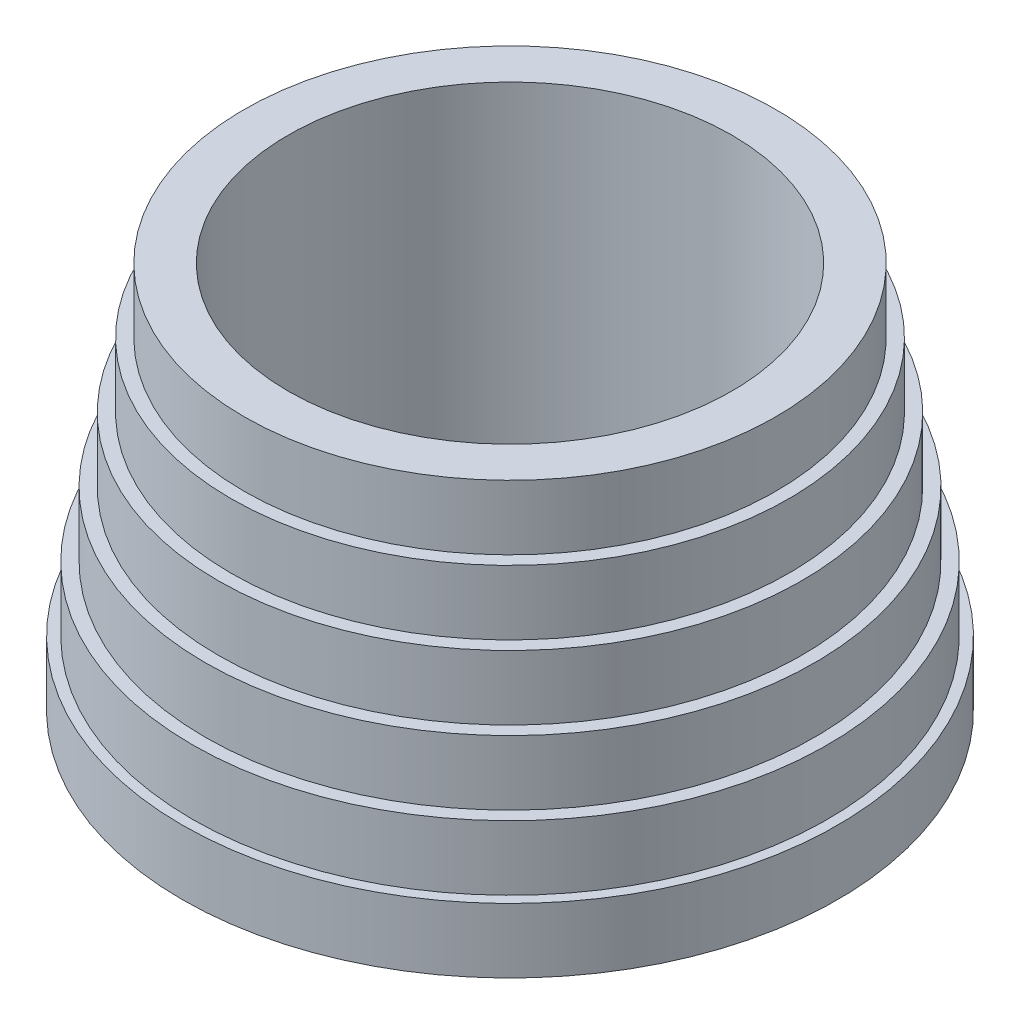
ISO-10303-21;
HEADER;
FILE_DESCRIPTION(('STEP AP214'),'2;1');
FILE_NAME('part.step','',(''),(''),'','','');
FILE_SCHEMA(('AUTOMOTIVE_DESIGN { 1 0 10303 214 1 1 1 1 }'));
ENDSEC;
DATA;
#1=APPLICATION_CONTEXT('core data for automotive mechanical design processes');
#2=APPLICATION_PROTOCOL_DEFINITION('international standard','automotive_design',2000,#1);
#3=PRODUCT_CONTEXT('',#1,'mechanical');
#4=PRODUCT('Part','Part','',(#3));
#5=PRODUCT_RELATED_PRODUCT_CATEGORY('part','',(#4));
#6=PRODUCT_DEFINITION_FORMATION('','',#4);
#7=PRODUCT_DEFINITION_CONTEXT('part definition',#1,'design');
#8=PRODUCT_DEFINITION('design','',#6,#7);
#9=PRODUCT_DEFINITION_SHAPE('','',#8);
#10=(LENGTH_UNIT() NAMED_UNIT(*) SI_UNIT(.MILLI.,.METRE.));
#11=(NAMED_UNIT(*) PLANE_ANGLE_UNIT() SI_UNIT($,.RADIAN.));
#12=(NAMED_UNIT(*) SI_UNIT($,.STERADIAN.) SOLID_ANGLE_UNIT());
#13=UNCERTAINTY_MEASURE_WITH_UNIT(LENGTH_MEASURE(1.E-05),#10,'distance_accuracy_value','');
#14=(GEOMETRIC_REPRESENTATION_CONTEXT(3) GLOBAL_UNCERTAINTY_ASSIGNED_CONTEXT((#13)) GLOBAL_UNIT_ASSIGNED_CONTEXT((#10,
#11,#12)) REPRESENTATION_CONTEXT('',''));
#15=CARTESIAN_POINT('',(0.,0.,0.));
#16=DIRECTION('',(0.,0.,1.));
#17=DIRECTION('',(1.,0.,0.));
#18=AXIS2_PLACEMENT_3D('',#15,#16,#17);
#19=CARTESIAN_POINT('',(0.,105.494376543482,0.));
#20=DIRECTION('',(0.,1.,0.));
#21=DIRECTION('',(0.,0.,1.));
#22=AXIS2_PLACEMENT_3D('',#19,#20,#21);
#23=CYLINDRICAL_SURFACE('',#22,225.994242039782);
#24=CARTESIAN_POINT('',(0.,-40.,0.));
#25=DIRECTION('',(0.,1.,0.));
#26=DIRECTION('',(0.,0.,1.));
#27=AXIS2_PLACEMENT_3D('',#24,#25,#26);
#28=CIRCLE('',#27,225.994242039782);
#29=CARTESIAN_POINT('',(0.,-40.,225.994242039782));
#30=VERTEX_POINT('',#29);
#31=EDGE_CURVE('E119',#30,#30,#28,.T.);
#32=ORIENTED_EDGE('',*,*,#31,.T.);
#33=EDGE_LOOP('',(#32));
#34=FACE_BOUND('',#33,.T.);
#35=CARTESIAN_POINT('',(0.,9.99999999999999,0.));
#36=DIRECTION('',(0.,1.,0.));
#37=DIRECTION('',(0.,0.,1.));
#38=AXIS2_PLACEMENT_3D('',#35,#36,#37);
#39=CIRCLE('',#38,225.994242039782);
#40=CARTESIAN_POINT('',(0.,9.99999999999999,225.994242039782));
#41=VERTEX_POINT('',#40);
#42=EDGE_CURVE('E53',#41,#41,#39,.T.);
#43=ORIENTED_EDGE('',*,*,#42,.F.);
#44=EDGE_LOOP('',(#43));
#45=FACE_BOUND('',#44,.T.);
#46=ADVANCED_FACE('F41',(#34,#45),#23,.T.);
#47=CARTESIAN_POINT('',(-225.994242039782,9.99999999999999,0.));
#48=DIRECTION('',(0.,1.,0.));
#49=DIRECTION('',(0.,0.,1.));
#50=AXIS2_PLACEMENT_3D('',#47,#48,#49);
#51=PLANE('',#50);
#52=ORIENTED_EDGE('',*,*,#42,.T.);
#53=EDGE_LOOP('',(#52));
#54=FACE_BOUND('',#53,.T.);
#55=CARTESIAN_POINT('',(0.,9.99999999999999,0.));
#56=DIRECTION('',(0.,1.,0.));
#57=DIRECTION('',(0.,0.,1.));
#58=AXIS2_PLACEMENT_3D('',#55,#56,#57);
#59=CIRCLE('',#58,215.994242039782);
#60=CARTESIAN_POINT('',(0.,9.99999999999999,215.994242039782));
#61=VERTEX_POINT('',#60);
#62=EDGE_CURVE('E57',#61,#61,#59,.T.);
#63=ORIENTED_EDGE('',*,*,#62,.F.);
#64=EDGE_LOOP('',(#63));
#65=FACE_BOUND('',#64,.T.);
#66=ADVANCED_FACE('F157',(#54,#65),#51,.T.);
#67=CARTESIAN_POINT('',(0.,105.494376543482,0.));
#68=DIRECTION('',(0.,1.,0.));
#69=DIRECTION('',(0.,0.,1.));
#70=AXIS2_PLACEMENT_3D('',#67,#68,#69);
#71=CYLINDRICAL_SURFACE('',#70,215.994242039782);
#72=ORIENTED_EDGE('',*,*,#62,.T.);
#73=EDGE_LOOP('',(#72));
#74=FACE_BOUND('',#73,.T.);
#75=CARTESIAN_POINT('',(0.,60.,0.));
#76=DIRECTION('',(0.,1.,0.));
#77=DIRECTION('',(0.,0.,1.));
#78=AXIS2_PLACEMENT_3D('',#75,#76,#77);
#79=CIRCLE('',#78,215.994242039782);
#80=CARTESIAN_POINT('',(0.,60.,215.994242039782));
#81=VERTEX_POINT('',#80);
#82=EDGE_CURVE('E62',#81,#81,#79,.T.);
#83=ORIENTED_EDGE('',*,*,#82,.F.);
#84=EDGE_LOOP('',(#83));
#85=FACE_BOUND('',#84,.T.);
#86=ADVANCED_FACE('F162',(#74,#85),#71,.T.);
#87=CARTESIAN_POINT('',(-215.994242039782,60.,0.));
#88=DIRECTION('',(0.,1.,0.));
#89=DIRECTION('',(0.,0.,1.));
#90=AXIS2_PLACEMENT_3D('',#87,#88,#89);
#91=PLANE('',#90);
#92=ORIENTED_EDGE('',*,*,#82,.T.);
#93=EDGE_LOOP('',(#92));
#94=FACE_BOUND('',#93,.T.);
#95=CARTESIAN_POINT('',(0.,60.,0.));
#96=DIRECTION('',(0.,1.,0.));
#97=DIRECTION('',(0.,0.,1.));
#98=AXIS2_PLACEMENT_3D('',#95,#96,#97);
#99=CIRCLE('',#98,205.994242039782);
#100=CARTESIAN_POINT('',(0.,60.,205.994242039782));
#101=VERTEX_POINT('',#100);
#102=EDGE_CURVE('E65',#101,#101,#99,.T.);
#103=ORIENTED_EDGE('',*,*,#102,.F.);
#104=EDGE_LOOP('',(#103));
#105=FACE_BOUND('',#104,.T.);
#106=ADVANCED_FACE('F153',(#94,#105),#91,.T.);
#107=CARTESIAN_POINT('',(0.,105.494376543482,0.));
#108=DIRECTION('',(0.,1.,0.));
#109=DIRECTION('',(0.,0.,1.));
#110=AXIS2_PLACEMENT_3D('',#107,#108,#109);
#111=CYLINDRICAL_SURFACE('',#110,205.994242039782);
#112=ORIENTED_EDGE('',*,*,#102,.T.);
#113=EDGE_LOOP('',(#112));
#114=FACE_BOUND('',#113,.T.);
#115=CARTESIAN_POINT('',(0.,110.,0.));
#116=DIRECTION('',(0.,1.,0.));
#117=DIRECTION('',(0.,0.,1.));
#118=AXIS2_PLACEMENT_3D('',#115,#116,#117);
#119=CIRCLE('',#118,205.994242039782);
#120=CARTESIAN_POINT('',(0.,110.,205.994242039782));
#121=VERTEX_POINT('',#120);
#122=EDGE_CURVE('E68',#121,#121,#119,.T.);
#123=ORIENTED_EDGE('',*,*,#122,.F.);
#124=EDGE_LOOP('',(#123));
#125=FACE_BOUND('',#124,.T.);
#126=ADVANCED_FACE('F143',(#114,#125),#111,.T.);
#127=CARTESIAN_POINT('',(-205.994242039782,110.,0.));
#128=DIRECTION('',(0.,1.,0.));
#129=DIRECTION('',(0.,0.,1.));
#130=AXIS2_PLACEMENT_3D('',#127,#128,#129);
#131=PLANE('',#130);
#132=ORIENTED_EDGE('',*,*,#122,.T.);
#133=EDGE_LOOP('',(#132));
#134=FACE_BOUND('',#133,.T.);
#135=CARTESIAN_POINT('',(0.,110.,0.));
#136=DIRECTION('',(0.,1.,0.));
#137=DIRECTION('',(0.,0.,1.));
#138=AXIS2_PLACEMENT_3D('',#135,#136,#137);
#139=CIRCLE('',#138,171.779053358079);
#140=CARTESIAN_POINT('',(0.,110.,171.779053358079));
#141=VERTEX_POINT('',#140);
#142=EDGE_CURVE('E126',#141,#141,#139,.T.);
#143=ORIENTED_EDGE('',*,*,#142,.F.);
#144=EDGE_LOOP('',(#143));
#145=FACE_BOUND('',#144,.T.);
#146=ADVANCED_FACE('F140',(#134,#145),#131,.T.);
#147=CARTESIAN_POINT('',(-205.994242039782,50.,0.));
#148=DIRECTION('',(0.,-1.,0.));
#149=DIRECTION('',(0.,0.,-1.));
#150=AXIS2_PLACEMENT_3D('',#147,#148,#149);
#151=PLANE('',#150);
#152=CARTESIAN_POINT('',(0.,50.,0.));
#153=DIRECTION('',(0.,-1.,0.));
#154=DIRECTION('',(0.,0.,-1.));
#155=AXIS2_PLACEMENT_3D('',#152,#153,#154);
#156=CIRCLE('',#155,195.994242039782);
#157=CARTESIAN_POINT('',(0.,50.,-195.994242039782));
#158=VERTEX_POINT('',#157);
#159=EDGE_CURVE('E122',#158,#158,#156,.T.);
#160=ORIENTED_EDGE('',*,*,#159,.F.);
#161=EDGE_LOOP('',(#160));
#162=FACE_BOUND('',#161,.T.);
#163=CARTESIAN_POINT('',(0.,50.,0.));
#164=DIRECTION('',(0.,1.,0.));
#165=DIRECTION('',(0.,0.,1.));
#166=AXIS2_PLACEMENT_3D('',#163,#164,#165);
#167=CIRCLE('',#166,205.994242039782);
#168=CARTESIAN_POINT('',(0.,50.,205.994242039782));
#169=VERTEX_POINT('',#168);
#170=EDGE_CURVE('E71',#169,#169,#167,.T.);
#171=ORIENTED_EDGE('',*,*,#170,.F.);
#172=EDGE_LOOP('',(#171));
#173=FACE_BOUND('',#172,.T.);
#174=ADVANCED_FACE('F142',(#162,#173),#151,.T.);
#175=CARTESIAN_POINT('',(0.,105.494376543482,0.));
#176=DIRECTION('',(0.,1.,0.));
#177=DIRECTION('',(0.,0.,1.));
#178=AXIS2_PLACEMENT_3D('',#175,#176,#177);
#179=CYLINDRICAL_SURFACE('',#178,205.994242039782);
#180=ORIENTED_EDGE('',*,*,#170,.T.);
#181=EDGE_LOOP('',(#180));
#182=FACE_BOUND('',#181,.T.);
#183=CARTESIAN_POINT('',(0.,0.,0.));
#184=DIRECTION('',(0.,1.,0.));
#185=DIRECTION('',(0.,0.,1.));
#186=AXIS2_PLACEMENT_3D('',#183,#184,#185);
#187=CIRCLE('',#186,205.994242039782);
#188=CARTESIAN_POINT('',(0.,0.,205.994242039782));
#189=VERTEX_POINT('',#188);
#190=EDGE_CURVE('E74',#189,#189,#187,.T.);
#191=ORIENTED_EDGE('',*,*,#190,.F.);
#192=EDGE_LOOP('',(#191));
#193=FACE_BOUND('',#192,.T.);
#194=ADVANCED_FACE('F150',(#182,#193),#179,.F.);
#195=CARTESIAN_POINT('',(-215.994242039782,0.,0.));
#196=DIRECTION('',(0.,-1.,0.));
#197=DIRECTION('',(0.,0.,-1.));
#198=AXIS2_PLACEMENT_3D('',#195,#196,#197);
#199=PLANE('',#198);
#200=ORIENTED_EDGE('',*,*,#190,.T.);
#201=EDGE_LOOP('',(#200));
#202=FACE_BOUND('',#201,.T.);
#203=CARTESIAN_POINT('',(0.,0.,0.));
#204=DIRECTION('',(0.,1.,0.));
#205=DIRECTION('',(0.,0.,1.));
#206=AXIS2_PLACEMENT_3D('',#203,#204,#205);
#207=CIRCLE('',#206,215.994242039782);
#208=CARTESIAN_POINT('',(0.,0.,215.994242039782));
#209=VERTEX_POINT('',#208);
#210=EDGE_CURVE('E77',#209,#209,#207,.T.);
#211=ORIENTED_EDGE('',*,*,#210,.F.);
#212=EDGE_LOOP('',(#211));
#213=FACE_BOUND('',#212,.T.);
#214=ADVANCED_FACE('F204',(#202,#213),#199,.T.);
#215=CARTESIAN_POINT('',(0.,105.494376543482,0.));
#216=DIRECTION('',(0.,1.,0.));
#217=DIRECTION('',(0.,0.,1.));
#218=AXIS2_PLACEMENT_3D('',#215,#216,#217);
#219=CYLINDRICAL_SURFACE('',#218,215.994242039782);
#220=ORIENTED_EDGE('',*,*,#210,.T.);
#221=EDGE_LOOP('',(#220));
#222=FACE_BOUND('',#221,.T.);
#223=CARTESIAN_POINT('',(0.,-50.,0.));
#224=DIRECTION('',(0.,1.,0.));
#225=DIRECTION('',(0.,0.,1.));
#226=AXIS2_PLACEMENT_3D('',#223,#224,#225);
#227=CIRCLE('',#226,215.994242039782);
#228=CARTESIAN_POINT('',(0.,-50.,215.994242039782));
#229=VERTEX_POINT('',#228);
#230=EDGE_CURVE('E80',#229,#229,#227,.T.);
#231=ORIENTED_EDGE('',*,*,#230,.F.);
#232=EDGE_LOOP('',(#231));
#233=FACE_BOUND('',#232,.T.);
#234=ADVANCED_FACE('F215',(#222,#233),#219,.F.);
#235=CARTESIAN_POINT('',(-225.994242039782,-50.,0.));
#236=DIRECTION('',(0.,-1.,0.));
#237=DIRECTION('',(0.,0.,-1.));
#238=AXIS2_PLACEMENT_3D('',#235,#236,#237);
#239=PLANE('',#238);
#240=ORIENTED_EDGE('',*,*,#230,.T.);
#241=EDGE_LOOP('',(#240));
#242=FACE_BOUND('',#241,.T.);
#243=CARTESIAN_POINT('',(0.,-50.,0.));
#244=DIRECTION('',(0.,1.,0.));
#245=DIRECTION('',(0.,0.,1.));
#246=AXIS2_PLACEMENT_3D('',#243,#244,#245);
#247=CIRCLE('',#246,225.994242039782);
#248=CARTESIAN_POINT('',(0.,-50.,225.994242039782));
#249=VERTEX_POINT('',#248);
#250=EDGE_CURVE('E83',#249,#249,#247,.T.);
#251=ORIENTED_EDGE('',*,*,#250,.F.);
#252=EDGE_LOOP('',(#251));
#253=FACE_BOUND('',#252,.T.);
#254=ADVANCED_FACE('F226',(#242,#253),#239,.T.);
#255=CARTESIAN_POINT('',(0.,105.494376543482,0.));
#256=DIRECTION('',(0.,1.,0.));
#257=DIRECTION('',(0.,0.,1.));
#258=AXIS2_PLACEMENT_3D('',#255,#256,#257);
#259=CYLINDRICAL_SURFACE('',#258,225.994242039782);
#260=ORIENTED_EDGE('',*,*,#250,.T.);
#261=EDGE_LOOP('',(#260));
#262=FACE_BOUND('',#261,.T.);
#263=CARTESIAN_POINT('',(0.,-100.,0.));
#264=DIRECTION('',(0.,1.,0.));
#265=DIRECTION('',(0.,0.,1.));
#266=AXIS2_PLACEMENT_3D('',#263,#264,#265);
#267=CIRCLE('',#266,225.994242039782);
#268=CARTESIAN_POINT('',(0.,-100.,225.994242039782));
#269=VERTEX_POINT('',#268);
#270=EDGE_CURVE('E86',#269,#269,#267,.T.);
#271=ORIENTED_EDGE('',*,*,#270,.F.);
#272=EDGE_LOOP('',(#271));
#273=FACE_BOUND('',#272,.T.);
#274=ADVANCED_FACE('F237',(#262,#273),#259,.F.);
#275=CARTESIAN_POINT('',(-235.994242039782,-100.,0.));
#276=DIRECTION('',(0.,-1.,0.));
#277=DIRECTION('',(0.,0.,-1.));
#278=AXIS2_PLACEMENT_3D('',#275,#276,#277);
#279=PLANE('',#278);
#280=ORIENTED_EDGE('',*,*,#270,.T.);
#281=EDGE_LOOP('',(#280));
#282=FACE_BOUND('',#281,.T.);
#283=CARTESIAN_POINT('',(0.,-100.,0.));
#284=DIRECTION('',(0.,1.,0.));
#285=DIRECTION('',(0.,0.,1.));
#286=AXIS2_PLACEMENT_3D('',#283,#284,#285);
#287=CIRCLE('',#286,235.994242039782);
#288=CARTESIAN_POINT('',(0.,-100.,235.994242039782));
#289=VERTEX_POINT('',#288);
#290=EDGE_CURVE('E89',#289,#289,#287,.T.);
#291=ORIENTED_EDGE('',*,*,#290,.F.);
#292=EDGE_LOOP('',(#291));
#293=FACE_BOUND('',#292,.T.);
#294=ADVANCED_FACE('F248',(#282,#293),#279,.T.);
#295=CARTESIAN_POINT('',(0.,105.494376543482,0.));
#296=DIRECTION('',(0.,1.,0.));
#297=DIRECTION('',(0.,0.,1.));
#298=AXIS2_PLACEMENT_3D('',#295,#296,#297);
#299=CYLINDRICAL_SURFACE('',#298,235.994242039782);
#300=ORIENTED_EDGE('',*,*,#290,.T.);
#301=EDGE_LOOP('',(#300));
#302=FACE_BOUND('',#301,.T.);
#303=CARTESIAN_POINT('',(0.,-150.,0.));
#304=DIRECTION('',(0.,1.,0.));
#305=DIRECTION('',(0.,0.,1.));
#306=AXIS2_PLACEMENT_3D('',#303,#304,#305);
#307=CIRCLE('',#306,235.994242039782);
#308=CARTESIAN_POINT('',(0.,-150.,235.994242039782));
#309=VERTEX_POINT('',#308);
#310=EDGE_CURVE('E92',#309,#309,#307,.T.);
#311=ORIENTED_EDGE('',*,*,#310,.F.);
#312=EDGE_LOOP('',(#311));
#313=FACE_BOUND('',#312,.T.);
#314=ADVANCED_FACE('F259',(#302,#313),#299,.F.);
#315=CARTESIAN_POINT('',(-245.994242039782,-150.,0.));
#316=DIRECTION('',(0.,-1.,0.));
#317=DIRECTION('',(0.,0.,-1.));
#318=AXIS2_PLACEMENT_3D('',#315,#316,#317);
#319=PLANE('',#318);
#320=ORIENTED_EDGE('',*,*,#310,.T.);
#321=EDGE_LOOP('',(#320));
#322=FACE_BOUND('',#321,.T.);
#323=CARTESIAN_POINT('',(0.,-150.,0.));
#324=DIRECTION('',(0.,1.,0.));
#325=DIRECTION('',(0.,0.,1.));
#326=AXIS2_PLACEMENT_3D('',#323,#324,#325);
#327=CIRCLE('',#326,245.994242039782);
#328=CARTESIAN_POINT('',(0.,-150.,245.994242039782));
#329=VERTEX_POINT('',#328);
#330=EDGE_CURVE('E95',#329,#329,#327,.T.);
#331=ORIENTED_EDGE('',*,*,#330,.F.);
#332=EDGE_LOOP('',(#331));
#333=FACE_BOUND('',#332,.T.);
#334=ADVANCED_FACE('F270',(#322,#333),#319,.T.);
#335=CARTESIAN_POINT('',(0.,105.494376543482,0.));
#336=DIRECTION('',(0.,1.,0.));
#337=DIRECTION('',(0.,0.,1.));
#338=AXIS2_PLACEMENT_3D('',#335,#336,#337);
#339=CYLINDRICAL_SURFACE('',#338,245.994242039782);
#340=ORIENTED_EDGE('',*,*,#330,.T.);
#341=EDGE_LOOP('',(#340));
#342=FACE_BOUND('',#341,.T.);
#343=CARTESIAN_POINT('',(0.,-190.,0.));
#344=DIRECTION('',(0.,1.,0.));
#345=DIRECTION('',(0.,0.,1.));
#346=AXIS2_PLACEMENT_3D('',#343,#344,#345);
#347=CIRCLE('',#346,245.994242039782);
#348=CARTESIAN_POINT('',(0.,-190.,245.994242039782));
#349=VERTEX_POINT('',#348);
#350=EDGE_CURVE('E98',#349,#349,#347,.T.);
#351=ORIENTED_EDGE('',*,*,#350,.F.);
#352=EDGE_LOOP('',(#351));
#353=FACE_BOUND('',#352,.T.);
#354=ADVANCED_FACE('F281',(#342,#353),#339,.F.);
#355=CARTESIAN_POINT('',(-253.775337615062,-190.,0.));
#356=DIRECTION('',(0.,-1.,0.));
#357=DIRECTION('',(0.,0.,-1.));
#358=AXIS2_PLACEMENT_3D('',#355,#356,#357);
#359=PLANE('',#358);
#360=ORIENTED_EDGE('',*,*,#350,.T.);
#361=EDGE_LOOP('',(#360));
#362=FACE_BOUND('',#361,.T.);
#363=CARTESIAN_POINT('',(0.,-190.,0.));
#364=DIRECTION('',(0.,1.,0.));
#365=DIRECTION('',(0.,0.,1.));
#366=AXIS2_PLACEMENT_3D('',#363,#364,#365);
#367=CIRCLE('',#366,253.775337615062);
#368=CARTESIAN_POINT('',(0.,-190.,253.775337615062));
#369=VERTEX_POINT('',#368);
#370=EDGE_CURVE('E101',#369,#369,#367,.T.);
#371=ORIENTED_EDGE('',*,*,#370,.F.);
#372=EDGE_LOOP('',(#371));
#373=FACE_BOUND('',#372,.T.);
#374=ADVANCED_FACE('F292',(#362,#373),#359,.T.);
#375=CARTESIAN_POINT('',(0.,105.494376543482,0.));
#376=DIRECTION('',(0.,1.,0.));
#377=DIRECTION('',(0.,0.,1.));
#378=AXIS2_PLACEMENT_3D('',#375,#376,#377);
#379=CYLINDRICAL_SURFACE('',#378,253.775337615062);
#380=ORIENTED_EDGE('',*,*,#370,.T.);
#381=EDGE_LOOP('',(#380));
#382=FACE_BOUND('',#381,.T.);
#383=CARTESIAN_POINT('',(0.,-140.,0.));
#384=DIRECTION('',(0.,1.,0.));
#385=DIRECTION('',(0.,0.,1.));
#386=AXIS2_PLACEMENT_3D('',#383,#384,#385);
#387=CIRCLE('',#386,253.775337615062);
#388=CARTESIAN_POINT('',(0.,-140.,253.775337615062));
#389=VERTEX_POINT('',#388);
#390=EDGE_CURVE('E104',#389,#389,#387,.T.);
#391=ORIENTED_EDGE('',*,*,#390,.F.);
#392=EDGE_LOOP('',(#391));
#393=FACE_BOUND('',#392,.T.);
#394=ADVANCED_FACE('F303',(#382,#393),#379,.T.);
#395=CARTESIAN_POINT('',(-253.775337615062,-140.,0.));
#396=DIRECTION('',(0.,1.,0.));
#397=DIRECTION('',(0.,0.,1.));
#398=AXIS2_PLACEMENT_3D('',#395,#396,#397);
#399=PLANE('',#398);
#400=ORIENTED_EDGE('',*,*,#390,.T.);
#401=EDGE_LOOP('',(#400));
#402=FACE_BOUND('',#401,.T.);
#403=CARTESIAN_POINT('',(0.,-140.,0.));
#404=DIRECTION('',(0.,1.,0.));
#405=DIRECTION('',(0.,0.,1.));
#406=AXIS2_PLACEMENT_3D('',#403,#404,#405);
#407=CIRCLE('',#406,245.994242039782);
#408=CARTESIAN_POINT('',(0.,-140.,245.994242039782));
#409=VERTEX_POINT('',#408);
#410=EDGE_CURVE('E107',#409,#409,#407,.T.);
#411=ORIENTED_EDGE('',*,*,#410,.F.);
#412=EDGE_LOOP('',(#411));
#413=FACE_BOUND('',#412,.T.);
#414=ADVANCED_FACE('F314',(#402,#413),#399,.T.);
#415=CARTESIAN_POINT('',(0.,105.494376543482,0.));
#416=DIRECTION('',(0.,1.,0.));
#417=DIRECTION('',(0.,0.,1.));
#418=AXIS2_PLACEMENT_3D('',#415,#416,#417);
#419=CYLINDRICAL_SURFACE('',#418,245.994242039782);
#420=ORIENTED_EDGE('',*,*,#410,.T.);
#421=EDGE_LOOP('',(#420));
#422=FACE_BOUND('',#421,.T.);
#423=CARTESIAN_POINT('',(0.,-90.,0.));
#424=DIRECTION('',(0.,1.,0.));
#425=DIRECTION('',(0.,0.,1.));
#426=AXIS2_PLACEMENT_3D('',#423,#424,#425);
#427=CIRCLE('',#426,245.994242039782);
#428=CARTESIAN_POINT('',(0.,-90.,245.994242039782));
#429=VERTEX_POINT('',#428);
#430=EDGE_CURVE('E110',#429,#429,#427,.T.);
#431=ORIENTED_EDGE('',*,*,#430,.F.);
#432=EDGE_LOOP('',(#431));
#433=FACE_BOUND('',#432,.T.);
#434=ADVANCED_FACE('F325',(#422,#433),#419,.T.);
#435=CARTESIAN_POINT('',(-245.994242039782,-90.,0.));
#436=DIRECTION('',(0.,1.,0.));
#437=DIRECTION('',(0.,0.,1.));
#438=AXIS2_PLACEMENT_3D('',#435,#436,#437);
#439=PLANE('',#438);
#440=ORIENTED_EDGE('',*,*,#430,.T.);
#441=EDGE_LOOP('',(#440));
#442=FACE_BOUND('',#441,.T.);
#443=CARTESIAN_POINT('',(0.,-90.,0.));
#444=DIRECTION('',(0.,1.,0.));
#445=DIRECTION('',(0.,0.,1.));
#446=AXIS2_PLACEMENT_3D('',#443,#444,#445);
#447=CIRCLE('',#446,235.994242039782);
#448=CARTESIAN_POINT('',(0.,-90.,235.994242039782));
#449=VERTEX_POINT('',#448);
#450=EDGE_CURVE('E113',#449,#449,#447,.T.);
#451=ORIENTED_EDGE('',*,*,#450,.F.);
#452=EDGE_LOOP('',(#451));
#453=FACE_BOUND('',#452,.T.);
#454=ADVANCED_FACE('F336',(#442,#453),#439,.T.);
#455=CARTESIAN_POINT('',(0.,105.494376543482,0.));
#456=DIRECTION('',(0.,1.,0.));
#457=DIRECTION('',(0.,0.,1.));
#458=AXIS2_PLACEMENT_3D('',#455,#456,#457);
#459=CYLINDRICAL_SURFACE('',#458,235.994242039782);
#460=ORIENTED_EDGE('',*,*,#450,.T.);
#461=EDGE_LOOP('',(#460));
#462=FACE_BOUND('',#461,.T.);
#463=CARTESIAN_POINT('',(0.,-40.,0.));
#464=DIRECTION('',(0.,1.,0.));
#465=DIRECTION('',(0.,0.,1.));
#466=AXIS2_PLACEMENT_3D('',#463,#464,#465);
#467=CIRCLE('',#466,235.994242039782);
#468=CARTESIAN_POINT('',(0.,-40.,235.994242039782));
#469=VERTEX_POINT('',#468);
#470=EDGE_CURVE('E116',#469,#469,#467,.T.);
#471=ORIENTED_EDGE('',*,*,#470,.F.);
#472=EDGE_LOOP('',(#471));
#473=FACE_BOUND('',#472,.T.);
#474=ADVANCED_FACE('F347',(#462,#473),#459,.T.);
#475=CARTESIAN_POINT('',(-235.994242039782,-40.,0.));
#476=DIRECTION('',(0.,1.,0.));
#477=DIRECTION('',(0.,0.,1.));
#478=AXIS2_PLACEMENT_3D('',#475,#476,#477);
#479=PLANE('',#478);
#480=ORIENTED_EDGE('',*,*,#470,.T.);
#481=EDGE_LOOP('',(#480));
#482=FACE_BOUND('',#481,.T.);
#483=ORIENTED_EDGE('',*,*,#31,.F.);
#484=EDGE_LOOP('',(#483));
#485=FACE_BOUND('',#484,.T.);
#486=ADVANCED_FACE('F358',(#482,#485),#479,.T.);
#487=CARTESIAN_POINT('',(0.,-170.985470497558,0.));
#488=DIRECTION('',(0.,1.,0.));
#489=DIRECTION('',(0.,0.,1.));
#490=AXIS2_PLACEMENT_3D('',#487,#488,#489);
#491=CYLINDRICAL_SURFACE('',#490,195.994242039782);
#492=CARTESIAN_POINT('',(0.,-160.985470497558,0.));
#493=DIRECTION('',(0.,1.,0.));
#494=DIRECTION('',(0.,0.,1.));
#495=AXIS2_PLACEMENT_3D('',#492,#493,#494);
#496=CIRCLE('',#495,195.994242039782);
#497=CARTESIAN_POINT('',(0.,-160.985470497558,195.994242039782));
#498=VERTEX_POINT('',#497);
#499=EDGE_CURVE('E49',#498,#498,#496,.T.);
#500=ORIENTED_EDGE('',*,*,#499,.T.);
#501=EDGE_LOOP('',(#500));
#502=FACE_BOUND('',#501,.T.);
#503=ORIENTED_EDGE('',*,*,#159,.T.);
#504=EDGE_LOOP('',(#503));
#505=FACE_BOUND('',#504,.T.);
#506=ADVANCED_FACE('F368',(#502,#505),#491,.T.);
#507=CARTESIAN_POINT('',(0.,-170.985470497558,0.));
#508=DIRECTION('',(0.,1.,0.));
#509=DIRECTION('',(0.,0.,1.));
#510=AXIS2_PLACEMENT_3D('',#507,#508,#509);
#511=PLANE('',#510);
#512=CARTESIAN_POINT('',(0.,-170.985470497558,0.));
#513=DIRECTION('',(0.,1.,0.));
#514=DIRECTION('',(0.,0.,1.));
#515=AXIS2_PLACEMENT_3D('',#512,#513,#514);
#516=CIRCLE('',#515,185.994242039782);
#517=CARTESIAN_POINT('',(0.,-170.985470497558,185.994242039782));
#518=VERTEX_POINT('',#517);
#519=EDGE_CURVE('E10',#518,#518,#516,.F.);
#520=ORIENTED_EDGE('',*,*,#519,.T.);
#521=EDGE_LOOP('',(#520));
#522=FACE_BOUND('',#521,.T.);
#523=CARTESIAN_POINT('',(0.,-170.985470497558,0.));
#524=DIRECTION('',(0.,1.,0.));
#525=DIRECTION('',(0.,0.,1.));
#526=AXIS2_PLACEMENT_3D('',#523,#524,#525);
#527=CIRCLE('',#526,171.779053358079);
#528=CARTESIAN_POINT('',(0.,-170.985470497558,171.779053358079));
#529=VERTEX_POINT('',#528);
#530=EDGE_CURVE('E125',#529,#529,#527,.T.);
#531=ORIENTED_EDGE('',*,*,#530,.T.);
#532=EDGE_LOOP('',(#531));
#533=FACE_BOUND('',#532,.T.);
#534=ADVANCED_FACE('F132',(#522,#533),#511,.F.);
#535=CARTESIAN_POINT('',(0.,-170.985470497558,0.));
#536=DIRECTION('',(0.,1.,0.));
#537=DIRECTION('',(0.,0.,1.));
#538=AXIS2_PLACEMENT_3D('',#535,#536,#537);
#539=CYLINDRICAL_SURFACE('',#538,171.779053358079);
#540=ORIENTED_EDGE('',*,*,#530,.F.);
#541=EDGE_LOOP('',(#540));
#542=FACE_BOUND('',#541,.T.);
#543=ORIENTED_EDGE('',*,*,#142,.T.);
#544=EDGE_LOOP('',(#543));
#545=FACE_BOUND('',#544,.T.);
#546=ADVANCED_FACE('F134',(#542,#545),#539,.F.);
#547=CARTESIAN_POINT('',(0.,-160.985470497558,0.));
#548=DIRECTION('',(0.,1.,0.));
#549=DIRECTION('',(0.,0.,1.));
#550=AXIS2_PLACEMENT_3D('',#547,#548,#549);
#551=CONICAL_SURFACE('',#550,195.994242039782,0.78539816339745);
#552=ORIENTED_EDGE('',*,*,#519,.F.);
#553=EDGE_LOOP('',(#552));
#554=FACE_BOUND('',#553,.T.);
#555=ORIENTED_EDGE('',*,*,#499,.F.);
#556=EDGE_LOOP('',(#555));
#557=FACE_BOUND('',#556,.T.);
#558=ADVANCED_FACE('F44',(#554,#557),#551,.T.);
#559=CLOSED_SHELL('',(#46,#66,#86,#106,#126,#146,#174,#194,#214,#234,#254,#274,#294,#314,#334,
#354,#374,#394,#414,#434,#454,#474,#486,#506,#534,#546,#558));
#560=MANIFOLD_SOLID_BREP('B2',#559);
#561=ADVANCED_BREP_SHAPE_REPRESENTATION('',(#18,#560),#14);
#562=SHAPE_DEFINITION_REPRESENTATION(#9,#561);
ENDSEC;
END-ISO-10303-21;
